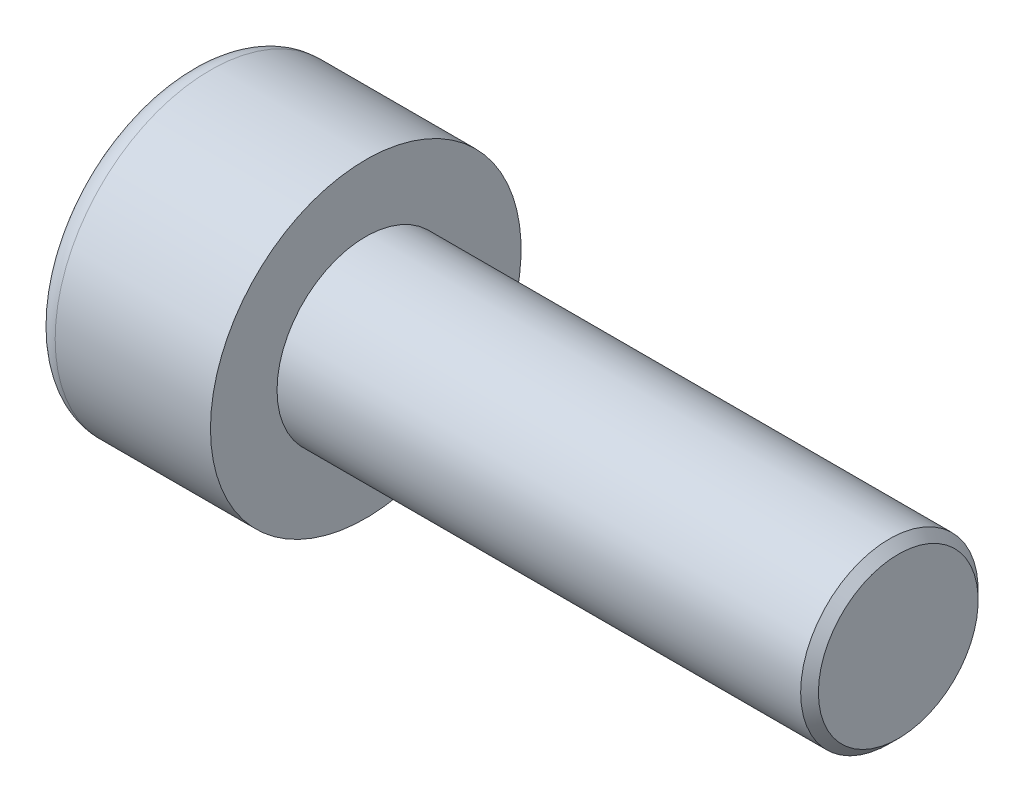
ISO-10303-21;
HEADER;
FILE_DESCRIPTION(('STEP AP214'),'2;1');
FILE_NAME('part.step','',(''),(''),'','','');
FILE_SCHEMA(('AUTOMOTIVE_DESIGN { 1 0 10303 214 1 1 1 1 }'));
ENDSEC;
DATA;
#1=APPLICATION_CONTEXT('core data for automotive mechanical design processes');
#2=APPLICATION_PROTOCOL_DEFINITION('international standard','automotive_design',2000,#1);
#3=PRODUCT_CONTEXT('',#1,'mechanical');
#4=PRODUCT('Part','Part','',(#3));
#5=PRODUCT_RELATED_PRODUCT_CATEGORY('part','',(#4));
#6=PRODUCT_DEFINITION_FORMATION('','',#4);
#7=PRODUCT_DEFINITION_CONTEXT('part definition',#1,'design');
#8=PRODUCT_DEFINITION('design','',#6,#7);
#9=PRODUCT_DEFINITION_SHAPE('','',#8);
#10=(LENGTH_UNIT() NAMED_UNIT(*) SI_UNIT(.MILLI.,.METRE.));
#11=(NAMED_UNIT(*) PLANE_ANGLE_UNIT() SI_UNIT($,.RADIAN.));
#12=(NAMED_UNIT(*) SI_UNIT($,.STERADIAN.) SOLID_ANGLE_UNIT());
#13=UNCERTAINTY_MEASURE_WITH_UNIT(LENGTH_MEASURE(1.E-05),#10,'distance_accuracy_value','');
#14=(GEOMETRIC_REPRESENTATION_CONTEXT(3) GLOBAL_UNCERTAINTY_ASSIGNED_CONTEXT((#13)) GLOBAL_UNIT_ASSIGNED_CONTEXT((#10,
#11,#12)) REPRESENTATION_CONTEXT('',''));
#15=CARTESIAN_POINT('',(0.,0.,0.));
#16=DIRECTION('',(0.,0.,1.));
#17=DIRECTION('',(1.,0.,0.));
#18=AXIS2_PLACEMENT_3D('',#15,#16,#17);
#19=CARTESIAN_POINT('',(0.,0.,0.));
#20=DIRECTION('',(1.,0.,0.));
#21=DIRECTION('',(0.,0.,-1.));
#22=AXIS2_PLACEMENT_3D('',#19,#20,#21);
#23=PLANE('',#22);
#24=DIRECTION('',(0.,0.866025403784439,0.5));
#25=VECTOR('',#24,1.);
#26=CARTESIAN_POINT('',(0.,-1.5,0.866025403784439));
#27=LINE('',#26,#25);
#28=CARTESIAN_POINT('',(0.,-1.5,0.866025403784439));
#29=VERTEX_POINT('',#28);
#30=CARTESIAN_POINT('',(0.,0.,1.73205080756887));
#31=VERTEX_POINT('',#30);
#32=EDGE_CURVE('E91',#29,#31,#27,.T.);
#33=ORIENTED_EDGE('',*,*,#32,.F.);
#34=DIRECTION('',(0.,0.,1.));
#35=VECTOR('',#34,1.);
#36=CARTESIAN_POINT('',(0.,-1.5,-0.866025403784439));
#37=LINE('',#36,#35);
#38=CARTESIAN_POINT('',(0.,-1.5,-0.866025403784439));
#39=VERTEX_POINT('',#38);
#40=EDGE_CURVE('E33',#39,#29,#37,.T.);
#41=ORIENTED_EDGE('',*,*,#40,.F.);
#42=DIRECTION('',(0.,-0.866025403784439,0.5));
#43=VECTOR('',#42,1.);
#44=CARTESIAN_POINT('',(0.,0.,-1.73205080756888));
#45=LINE('',#44,#43);
#46=CARTESIAN_POINT('',(0.,0.,-1.73205080756888));
#47=VERTEX_POINT('',#46);
#48=EDGE_CURVE('E106',#47,#39,#45,.T.);
#49=ORIENTED_EDGE('',*,*,#48,.F.);
#50=DIRECTION('',(0.,-0.866025403784439,-0.5));
#51=VECTOR('',#50,1.);
#52=CARTESIAN_POINT('',(0.,1.5,-0.866025403784439));
#53=LINE('',#52,#51);
#54=CARTESIAN_POINT('',(0.,1.5,-0.866025403784439));
#55=VERTEX_POINT('',#54);
#56=EDGE_CURVE('E100',#55,#47,#53,.T.);
#57=ORIENTED_EDGE('',*,*,#56,.F.);
#58=DIRECTION('',(0.,0.,-1.));
#59=VECTOR('',#58,1.);
#60=CARTESIAN_POINT('',(0.,1.5,0.866025403784439));
#61=LINE('',#60,#59);
#62=CARTESIAN_POINT('',(0.,1.5,0.866025403784439));
#63=VERTEX_POINT('',#62);
#64=EDGE_CURVE('E98',#63,#55,#61,.T.);
#65=ORIENTED_EDGE('',*,*,#64,.F.);
#66=DIRECTION('',(0.,0.866025403784439,-0.5));
#67=VECTOR('',#66,1.);
#68=CARTESIAN_POINT('',(0.,0.,1.73205080756887));
#69=LINE('',#68,#67);
#70=EDGE_CURVE('E84',#31,#63,#69,.T.);
#71=ORIENTED_EDGE('',*,*,#70,.F.);
#72=EDGE_LOOP('',(#33,#41,#49,#57,#65,#71));
#73=FACE_BOUND('',#72,.T.);
#74=CARTESIAN_POINT('',(0.,0.,0.));
#75=DIRECTION('',(-1.,0.,0.));
#76=DIRECTION('',(0.,0.,1.));
#77=AXIS2_PLACEMENT_3D('',#74,#75,#76);
#78=CIRCLE('',#77,3.);
#79=CARTESIAN_POINT('',(0.,0.,3.));
#80=VERTEX_POINT('',#79);
#81=EDGE_CURVE('E12',#80,#80,#78,.T.);
#82=ORIENTED_EDGE('',*,*,#81,.T.);
#83=EDGE_LOOP('',(#82));
#84=FACE_BOUND('',#83,.T.);
#85=ADVANCED_FACE('F19',(#73,#84),#23,.F.);
#86=CARTESIAN_POINT('',(0.5,0.,0.));
#87=DIRECTION('',(-1.,0.,0.));
#88=DIRECTION('',(0.,0.,1.));
#89=AXIS2_PLACEMENT_3D('',#86,#87,#88);
#90=TOROIDAL_SURFACE('',#89,3.,0.5);
#91=ORIENTED_EDGE('',*,*,#81,.F.);
#92=EDGE_LOOP('',(#91));
#93=FACE_BOUND('',#92,.T.);
#94=CARTESIAN_POINT('',(0.5,0.,0.));
#95=DIRECTION('',(-1.,0.,0.));
#96=DIRECTION('',(0.,0.,1.));
#97=AXIS2_PLACEMENT_3D('',#94,#95,#96);
#98=CIRCLE('',#97,3.5);
#99=CARTESIAN_POINT('',(0.5,0.,3.5));
#100=VERTEX_POINT('',#99);
#101=EDGE_CURVE('E26',#100,#100,#98,.T.);
#102=ORIENTED_EDGE('',*,*,#101,.T.);
#103=EDGE_LOOP('',(#102));
#104=FACE_BOUND('',#103,.T.);
#105=ADVANCED_FACE('F132',(#93,#104),#90,.T.);
#106=CARTESIAN_POINT('',(0.,0.,0.));
#107=DIRECTION('',(-1.,0.,0.));
#108=DIRECTION('',(0.,0.,1.));
#109=AXIS2_PLACEMENT_3D('',#106,#107,#108);
#110=CYLINDRICAL_SURFACE('',#109,3.5);
#111=ORIENTED_EDGE('',*,*,#101,.F.);
#112=EDGE_LOOP('',(#111));
#113=FACE_BOUND('',#112,.T.);
#114=CARTESIAN_POINT('',(4.,0.,0.));
#115=DIRECTION('',(-1.,0.,0.));
#116=DIRECTION('',(0.,0.,1.));
#117=AXIS2_PLACEMENT_3D('',#114,#115,#116);
#118=CIRCLE('',#117,3.5);
#119=CARTESIAN_POINT('',(4.,0.,3.5));
#120=VERTEX_POINT('',#119);
#121=EDGE_CURVE('E127',#120,#120,#118,.T.);
#122=ORIENTED_EDGE('',*,*,#121,.T.);
#123=EDGE_LOOP('',(#122));
#124=FACE_BOUND('',#123,.T.);
#125=ADVANCED_FACE('F134',(#113,#124),#110,.T.);
#126=CARTESIAN_POINT('',(4.,3.5,0.));
#127=DIRECTION('',(-1.,0.,0.));
#128=DIRECTION('',(0.,0.,1.));
#129=AXIS2_PLACEMENT_3D('',#126,#127,#128);
#130=PLANE('',#129);
#131=ORIENTED_EDGE('',*,*,#121,.F.);
#132=EDGE_LOOP('',(#131));
#133=FACE_BOUND('',#132,.T.);
#134=CARTESIAN_POINT('',(4.,0.,0.));
#135=DIRECTION('',(-1.,0.,0.));
#136=DIRECTION('',(0.,0.,1.));
#137=AXIS2_PLACEMENT_3D('',#134,#135,#136);
#138=CIRCLE('',#137,2.);
#139=CARTESIAN_POINT('',(4.,0.,2.));
#140=VERTEX_POINT('',#139);
#141=EDGE_CURVE('E124',#140,#140,#138,.T.);
#142=ORIENTED_EDGE('',*,*,#141,.T.);
#143=EDGE_LOOP('',(#142));
#144=FACE_BOUND('',#143,.T.);
#145=ADVANCED_FACE('F137',(#133,#144),#130,.F.);
#146=CARTESIAN_POINT('',(0.,0.,0.));
#147=DIRECTION('',(-1.,0.,0.));
#148=DIRECTION('',(0.,0.,1.));
#149=AXIS2_PLACEMENT_3D('',#146,#147,#148);
#150=CYLINDRICAL_SURFACE('',#149,2.);
#151=ORIENTED_EDGE('',*,*,#141,.F.);
#152=EDGE_LOOP('',(#151));
#153=FACE_BOUND('',#152,.T.);
#154=CARTESIAN_POINT('',(15.8,0.,0.));
#155=DIRECTION('',(-1.,0.,0.));
#156=DIRECTION('',(0.,0.,1.));
#157=AXIS2_PLACEMENT_3D('',#154,#155,#156);
#158=CIRCLE('',#157,2.);
#159=CARTESIAN_POINT('',(15.8,0.,2.));
#160=VERTEX_POINT('',#159);
#161=EDGE_CURVE('E121',#160,#160,#158,.T.);
#162=ORIENTED_EDGE('',*,*,#161,.T.);
#163=EDGE_LOOP('',(#162));
#164=FACE_BOUND('',#163,.T.);
#165=ADVANCED_FACE('F143',(#153,#164),#150,.T.);
#166=CARTESIAN_POINT('',(16.,0.,0.));
#167=DIRECTION('',(-1.,0.,0.));
#168=DIRECTION('',(0.,0.,1.));
#169=AXIS2_PLACEMENT_3D('',#166,#167,#168);
#170=CONICAL_SURFACE('',#169,1.8,0.785398163397452);
#171=ORIENTED_EDGE('',*,*,#161,.F.);
#172=EDGE_LOOP('',(#171));
#173=FACE_BOUND('',#172,.T.);
#174=CARTESIAN_POINT('',(16.,0.,0.));
#175=DIRECTION('',(-1.,0.,0.));
#176=DIRECTION('',(0.,0.,1.));
#177=AXIS2_PLACEMENT_3D('',#174,#175,#176);
#178=CIRCLE('',#177,1.8);
#179=CARTESIAN_POINT('',(16.,0.,1.8));
#180=VERTEX_POINT('',#179);
#181=EDGE_CURVE('E118',#180,#180,#178,.T.);
#182=ORIENTED_EDGE('',*,*,#181,.T.);
#183=EDGE_LOOP('',(#182));
#184=FACE_BOUND('',#183,.T.);
#185=ADVANCED_FACE('F149',(#173,#184),#170,.T.);
#186=CARTESIAN_POINT('',(16.,1.8,0.));
#187=DIRECTION('',(-1.,0.,0.));
#188=DIRECTION('',(0.,0.,1.));
#189=AXIS2_PLACEMENT_3D('',#186,#187,#188);
#190=PLANE('',#189);
#191=ORIENTED_EDGE('',*,*,#181,.F.);
#192=EDGE_LOOP('',(#191));
#193=FACE_BOUND('',#192,.T.);
#194=ADVANCED_FACE('F155',(#193),#190,.F.);
#195=CARTESIAN_POINT('',(8.58257569495584,-1.5,-0.866025403784439));
#196=DIRECTION('',(0.,-1.,0.));
#197=DIRECTION('',(0.,0.,-1.));
#198=AXIS2_PLACEMENT_3D('',#195,#196,#197);
#199=PLANE('',#198);
#200=DIRECTION('',(0.,0.,-1.));
#201=VECTOR('',#200,1.);
#202=CARTESIAN_POINT('',(3.5,-1.5,-0.866025403784439));
#203=LINE('',#202,#201);
#204=CARTESIAN_POINT('',(3.5,-1.5,0.866025403784439));
#205=VERTEX_POINT('',#204);
#206=CARTESIAN_POINT('',(3.5,-1.5,-0.866025403784439));
#207=VERTEX_POINT('',#206);
#208=EDGE_CURVE('E52',#205,#207,#203,.T.);
#209=ORIENTED_EDGE('',*,*,#208,.T.);
#210=DIRECTION('',(-1.,0.,0.));
#211=VECTOR('',#210,1.);
#212=CARTESIAN_POINT('',(8.58257569495584,-1.5,-0.866025403784439));
#213=LINE('',#212,#211);
#214=EDGE_CURVE('E109',#207,#39,#213,.T.);
#215=ORIENTED_EDGE('',*,*,#214,.T.);
#216=ORIENTED_EDGE('',*,*,#40,.T.);
#217=DIRECTION('',(-1.,0.,0.));
#218=VECTOR('',#217,1.);
#219=CARTESIAN_POINT('',(8.58257569495584,-1.5,0.866025403784439));
#220=LINE('',#219,#218);
#221=EDGE_CURVE('E88',#205,#29,#220,.T.);
#222=ORIENTED_EDGE('',*,*,#221,.F.);
#223=EDGE_LOOP('',(#209,#215,#216,#222));
#224=FACE_BOUND('',#223,.T.);
#225=ADVANCED_FACE('F160',(#224),#199,.F.);
#226=CARTESIAN_POINT('',(8.58257569495584,0.,-1.73205080756888));
#227=DIRECTION('',(0.,-0.5,-0.866025403784439));
#228=DIRECTION('',(0.,0.866025403784439,-0.5));
#229=AXIS2_PLACEMENT_3D('',#226,#227,#228);
#230=PLANE('',#229);
#231=DIRECTION('',(0.,0.866025403784439,-0.5));
#232=VECTOR('',#231,1.);
#233=CARTESIAN_POINT('',(3.5,0.,-1.73205080756888));
#234=LINE('',#233,#232);
#235=CARTESIAN_POINT('',(3.5,0.,-1.73205080756888));
#236=VERTEX_POINT('',#235);
#237=EDGE_CURVE('E280',#207,#236,#234,.T.);
#238=ORIENTED_EDGE('',*,*,#237,.T.);
#239=DIRECTION('',(-1.,0.,0.));
#240=VECTOR('',#239,1.);
#241=CARTESIAN_POINT('',(8.58257569495584,0.,-1.73205080756888));
#242=LINE('',#241,#240);
#243=EDGE_CURVE('E111',#236,#47,#242,.T.);
#244=ORIENTED_EDGE('',*,*,#243,.T.);
#245=ORIENTED_EDGE('',*,*,#48,.T.);
#246=ORIENTED_EDGE('',*,*,#214,.F.);
#247=EDGE_LOOP('',(#238,#244,#245,#246));
#248=FACE_BOUND('',#247,.T.);
#249=ADVANCED_FACE('F167',(#248),#230,.F.);
#250=CARTESIAN_POINT('',(8.58257569495584,1.5,-0.866025403784439));
#251=DIRECTION('',(0.,0.5,-0.866025403784439));
#252=DIRECTION('',(0.,0.866025403784439,0.5));
#253=AXIS2_PLACEMENT_3D('',#250,#251,#252);
#254=PLANE('',#253);
#255=DIRECTION('',(0.,0.866025403784439,0.5));
#256=VECTOR('',#255,1.);
#257=CARTESIAN_POINT('',(3.5,1.5,-0.866025403784439));
#258=LINE('',#257,#256);
#259=CARTESIAN_POINT('',(3.5,1.5,-0.866025403784439));
#260=VERTEX_POINT('',#259);
#261=EDGE_CURVE('E283',#236,#260,#258,.T.);
#262=ORIENTED_EDGE('',*,*,#261,.T.);
#263=DIRECTION('',(-1.,0.,0.));
#264=VECTOR('',#263,1.);
#265=CARTESIAN_POINT('',(8.58257569495584,1.5,-0.866025403784439));
#266=LINE('',#265,#264);
#267=EDGE_CURVE('E113',#260,#55,#266,.T.);
#268=ORIENTED_EDGE('',*,*,#267,.T.);
#269=ORIENTED_EDGE('',*,*,#56,.T.);
#270=ORIENTED_EDGE('',*,*,#243,.F.);
#271=EDGE_LOOP('',(#262,#268,#269,#270));
#272=FACE_BOUND('',#271,.T.);
#273=ADVANCED_FACE('F231',(#272),#254,.F.);
#274=CARTESIAN_POINT('',(8.58257569495584,1.5,0.866025403784439));
#275=DIRECTION('',(0.,1.,0.));
#276=DIRECTION('',(0.,0.,1.));
#277=AXIS2_PLACEMENT_3D('',#274,#275,#276);
#278=PLANE('',#277);
#279=DIRECTION('',(0.,0.,1.));
#280=VECTOR('',#279,1.);
#281=CARTESIAN_POINT('',(3.5,1.5,0.866025403784439));
#282=LINE('',#281,#280);
#283=CARTESIAN_POINT('',(3.5,1.5,0.866025403784439));
#284=VERTEX_POINT('',#283);
#285=EDGE_CURVE('E42',#260,#284,#282,.T.);
#286=ORIENTED_EDGE('',*,*,#285,.T.);
#287=DIRECTION('',(-1.,0.,0.));
#288=VECTOR('',#287,1.);
#289=CARTESIAN_POINT('',(8.58257569495584,1.5,0.866025403784439));
#290=LINE('',#289,#288);
#291=EDGE_CURVE('E87',#284,#63,#290,.T.);
#292=ORIENTED_EDGE('',*,*,#291,.T.);
#293=ORIENTED_EDGE('',*,*,#64,.T.);
#294=ORIENTED_EDGE('',*,*,#267,.F.);
#295=EDGE_LOOP('',(#286,#292,#293,#294));
#296=FACE_BOUND('',#295,.T.);
#297=ADVANCED_FACE('F239',(#296),#278,.F.);
#298=CARTESIAN_POINT('',(8.58257569495584,0.,1.73205080756887));
#299=DIRECTION('',(0.,0.5,0.866025403784439));
#300=DIRECTION('',(0.,-0.866025403784439,0.5));
#301=AXIS2_PLACEMENT_3D('',#298,#299,#300);
#302=PLANE('',#301);
#303=DIRECTION('',(0.,-0.866025403784439,0.5));
#304=VECTOR('',#303,1.);
#305=CARTESIAN_POINT('',(3.5,0.,1.73205080756887));
#306=LINE('',#305,#304);
#307=CARTESIAN_POINT('',(3.5,0.,1.73205080756887));
#308=VERTEX_POINT('',#307);
#309=EDGE_CURVE('E86',#284,#308,#306,.T.);
#310=ORIENTED_EDGE('',*,*,#309,.T.);
#311=DIRECTION('',(-1.,0.,0.));
#312=VECTOR('',#311,1.);
#313=CARTESIAN_POINT('',(8.58257569495584,0.,1.73205080756887));
#314=LINE('',#313,#312);
#315=EDGE_CURVE('E79',#308,#31,#314,.T.);
#316=ORIENTED_EDGE('',*,*,#315,.T.);
#317=ORIENTED_EDGE('',*,*,#70,.T.);
#318=ORIENTED_EDGE('',*,*,#291,.F.);
#319=EDGE_LOOP('',(#310,#316,#317,#318));
#320=FACE_BOUND('',#319,.T.);
#321=ADVANCED_FACE('F81',(#320),#302,.F.);
#322=CARTESIAN_POINT('',(8.58257569495584,-1.5,0.866025403784439));
#323=DIRECTION('',(0.,-0.5,0.866025403784439));
#324=DIRECTION('',(0.,-0.866025403784439,-0.5));
#325=AXIS2_PLACEMENT_3D('',#322,#323,#324);
#326=PLANE('',#325);
#327=DIRECTION('',(0.,-0.866025403784439,-0.5));
#328=VECTOR('',#327,1.);
#329=CARTESIAN_POINT('',(3.5,-1.5,0.866025403784439));
#330=LINE('',#329,#328);
#331=EDGE_CURVE('E61',#308,#205,#330,.T.);
#332=ORIENTED_EDGE('',*,*,#331,.T.);
#333=ORIENTED_EDGE('',*,*,#221,.T.);
#334=ORIENTED_EDGE('',*,*,#32,.T.);
#335=ORIENTED_EDGE('',*,*,#315,.F.);
#336=EDGE_LOOP('',(#332,#333,#334,#335));
#337=FACE_BOUND('',#336,.T.);
#338=ADVANCED_FACE('F92',(#337),#326,.F.);
#339=CARTESIAN_POINT('',(3.5,3.5,0.));
#340=DIRECTION('',(-1.,0.,0.));
#341=DIRECTION('',(0.,0.,1.));
#342=AXIS2_PLACEMENT_3D('',#339,#340,#341);
#343=PLANE('',#342);
#344=ORIENTED_EDGE('',*,*,#208,.F.);
#345=ORIENTED_EDGE('',*,*,#331,.F.);
#346=ORIENTED_EDGE('',*,*,#309,.F.);
#347=ORIENTED_EDGE('',*,*,#285,.F.);
#348=ORIENTED_EDGE('',*,*,#261,.F.);
#349=ORIENTED_EDGE('',*,*,#237,.F.);
#350=EDGE_LOOP('',(#344,#345,#346,#347,#348,#349));
#351=FACE_BOUND('',#350,.T.);
#352=ADVANCED_FACE('F262',(#351),#343,.T.);
#353=CLOSED_SHELL('',(#85,#105,#125,#145,#165,#185,#194,#225,#249,#273,#297,#321,#338,#352));
#354=MANIFOLD_SOLID_BREP('B1',#353);
#355=ADVANCED_BREP_SHAPE_REPRESENTATION('',(#18,#354),#14);
#356=SHAPE_DEFINITION_REPRESENTATION(#9,#355);
ENDSEC;
END-ISO-10303-21;
